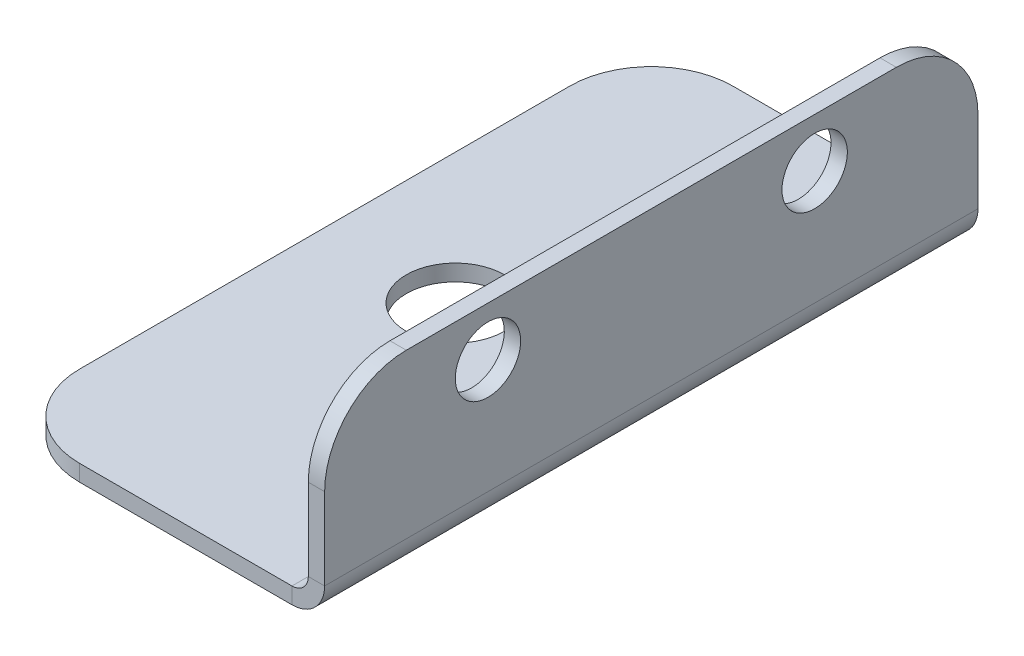
ISO-10303-21;
HEADER;
FILE_DESCRIPTION(('STEP AP214'),'2;1');
FILE_NAME('part.step','',(''),(''),'','','');
FILE_SCHEMA(('AUTOMOTIVE_DESIGN { 1 0 10303 214 1 1 1 1 }'));
ENDSEC;
DATA;
#1=APPLICATION_CONTEXT('core data for automotive mechanical design processes');
#2=APPLICATION_PROTOCOL_DEFINITION('international standard','automotive_design',2000,#1);
#3=PRODUCT_CONTEXT('',#1,'mechanical');
#4=PRODUCT('Part','Part','',(#3));
#5=PRODUCT_RELATED_PRODUCT_CATEGORY('part','',(#4));
#6=PRODUCT_DEFINITION_FORMATION('','',#4);
#7=PRODUCT_DEFINITION_CONTEXT('part definition',#1,'design');
#8=PRODUCT_DEFINITION('design','',#6,#7);
#9=PRODUCT_DEFINITION_SHAPE('','',#8);
#10=(LENGTH_UNIT() NAMED_UNIT(*) SI_UNIT(.MILLI.,.METRE.));
#11=(NAMED_UNIT(*) PLANE_ANGLE_UNIT() SI_UNIT($,.RADIAN.));
#12=(NAMED_UNIT(*) SI_UNIT($,.STERADIAN.) SOLID_ANGLE_UNIT());
#13=UNCERTAINTY_MEASURE_WITH_UNIT(LENGTH_MEASURE(1.E-05),#10,'distance_accuracy_value','');
#14=(GEOMETRIC_REPRESENTATION_CONTEXT(3) GLOBAL_UNCERTAINTY_ASSIGNED_CONTEXT((#13)) GLOBAL_UNIT_ASSIGNED_CONTEXT((#10,
#11,#12)) REPRESENTATION_CONTEXT('',''));
#15=CARTESIAN_POINT('',(0.,0.,0.));
#16=DIRECTION('',(0.,0.,1.));
#17=DIRECTION('',(1.,0.,0.));
#18=AXIS2_PLACEMENT_3D('',#15,#16,#17);
#19=CARTESIAN_POINT('',(-2.,0.,40.));
#20=DIRECTION('',(0.,0.,1.));
#21=DIRECTION('',(1.,0.,0.));
#22=AXIS2_PLACEMENT_3D('',#19,#20,#21);
#23=PLANE('',#22);
#24=DIRECTION('',(0.,1.,0.));
#25=VECTOR('',#24,1.);
#26=CARTESIAN_POINT('',(-2.,0.,40.));
#27=LINE('',#26,#25);
#28=CARTESIAN_POINT('',(-2.,0.,40.));
#29=VERTEX_POINT('',#28);
#30=CARTESIAN_POINT('',(-2.,1.,40.));
#31=VERTEX_POINT('',#30);
#32=EDGE_CURVE('E138',#29,#31,#27,.T.);
#33=ORIENTED_EDGE('',*,*,#32,.F.);
#34=CARTESIAN_POINT('',(-2.,2.,40.));
#35=DIRECTION('',(0.,0.,1.));
#36=DIRECTION('',(1.,0.,0.));
#37=AXIS2_PLACEMENT_3D('',#34,#35,#36);
#38=CIRCLE('',#37,2.);
#39=CARTESIAN_POINT('',(0.,2.,40.));
#40=VERTEX_POINT('',#39);
#41=EDGE_CURVE('E142',#40,#29,#38,.F.);
#42=ORIENTED_EDGE('',*,*,#41,.F.);
#43=DIRECTION('',(1.,0.,0.));
#44=VECTOR('',#43,1.);
#45=CARTESIAN_POINT('',(-1.,2.,40.));
#46=LINE('',#45,#44);
#47=CARTESIAN_POINT('',(-1.,2.,40.));
#48=VERTEX_POINT('',#47);
#49=EDGE_CURVE('E151',#48,#40,#46,.T.);
#50=ORIENTED_EDGE('',*,*,#49,.F.);
#51=CARTESIAN_POINT('',(-2.,2.,40.));
#52=DIRECTION('',(0.,0.,1.));
#53=DIRECTION('',(1.,0.,0.));
#54=AXIS2_PLACEMENT_3D('',#51,#52,#53);
#55=CIRCLE('',#54,1.);
#56=EDGE_CURVE('E144',#48,#31,#55,.F.);
#57=ORIENTED_EDGE('',*,*,#56,.T.);
#58=EDGE_LOOP('',(#33,#42,#50,#57));
#59=FACE_BOUND('',#58,.T.);
#60=ADVANCED_FACE('F47',(#59),#23,.T.);
#61=CARTESIAN_POINT('',(-1.,2.,40.));
#62=DIRECTION('',(0.,0.,1.));
#63=DIRECTION('',(1.,0.,0.));
#64=AXIS2_PLACEMENT_3D('',#61,#62,#63);
#65=PLANE('',#64);
#66=DIRECTION('',(-1.,0.,0.));
#67=VECTOR('',#66,1.);
#68=CARTESIAN_POINT('',(0.,1.,40.));
#69=LINE('',#68,#67);
#70=CARTESIAN_POINT('',(-15.,0.999999999999998,40.));
#71=VERTEX_POINT('',#70);
#72=EDGE_CURVE('E174',#31,#71,#69,.T.);
#73=ORIENTED_EDGE('',*,*,#72,.T.);
#74=DIRECTION('',(0.,1.,0.));
#75=VECTOR('',#74,1.);
#76=CARTESIAN_POINT('',(-15.,2.,40.));
#77=LINE('',#76,#75);
#78=CARTESIAN_POINT('',(-15.,0.,40.));
#79=VERTEX_POINT('',#78);
#80=EDGE_CURVE('E172',#71,#79,#77,.F.);
#81=ORIENTED_EDGE('',*,*,#80,.T.);
#82=DIRECTION('',(-1.,0.,0.));
#83=VECTOR('',#82,1.);
#84=CARTESIAN_POINT('',(0.,0.,40.));
#85=LINE('',#84,#83);
#86=EDGE_CURVE('E159',#29,#79,#85,.T.);
#87=ORIENTED_EDGE('',*,*,#86,.F.);
#88=ORIENTED_EDGE('',*,*,#32,.T.);
#89=EDGE_LOOP('',(#73,#81,#87,#88));
#90=FACE_BOUND('',#89,.T.);
#91=ADVANCED_FACE('F170',(#90),#65,.T.);
#92=CARTESIAN_POINT('',(0.,2.,0.));
#93=DIRECTION('',(0.,0.,-1.));
#94=DIRECTION('',(-1.,0.,0.));
#95=AXIS2_PLACEMENT_3D('',#92,#93,#94);
#96=PLANE('',#95);
#97=DIRECTION('',(-1.,0.,0.));
#98=VECTOR('',#97,1.);
#99=CARTESIAN_POINT('',(0.,2.,0.));
#100=LINE('',#99,#98);
#101=CARTESIAN_POINT('',(0.,2.,0.));
#102=VERTEX_POINT('',#101);
#103=CARTESIAN_POINT('',(-1.,2.,0.));
#104=VERTEX_POINT('',#103);
#105=EDGE_CURVE('E237',#102,#104,#100,.T.);
#106=ORIENTED_EDGE('',*,*,#105,.F.);
#107=CARTESIAN_POINT('',(-2.,2.,0.));
#108=DIRECTION('',(0.,0.,1.));
#109=DIRECTION('',(1.,0.,0.));
#110=AXIS2_PLACEMENT_3D('',#107,#108,#109);
#111=CIRCLE('',#110,2.);
#112=CARTESIAN_POINT('',(-2.,0.,0.));
#113=VERTEX_POINT('',#112);
#114=EDGE_CURVE('E199',#102,#113,#111,.F.);
#115=ORIENTED_EDGE('',*,*,#114,.T.);
#116=DIRECTION('',(0.,-1.,0.));
#117=VECTOR('',#116,1.);
#118=CARTESIAN_POINT('',(-2.,1.,0.));
#119=LINE('',#118,#117);
#120=CARTESIAN_POINT('',(-2.,1.,0.));
#121=VERTEX_POINT('',#120);
#122=EDGE_CURVE('E234',#121,#113,#119,.T.);
#123=ORIENTED_EDGE('',*,*,#122,.F.);
#124=CARTESIAN_POINT('',(-2.,2.,0.));
#125=DIRECTION('',(0.,0.,1.));
#126=DIRECTION('',(1.,0.,0.));
#127=AXIS2_PLACEMENT_3D('',#124,#125,#126);
#128=CIRCLE('',#127,1.);
#129=EDGE_CURVE('E208',#104,#121,#128,.F.);
#130=ORIENTED_EDGE('',*,*,#129,.F.);
#131=EDGE_LOOP('',(#106,#115,#123,#130));
#132=FACE_BOUND('',#131,.T.);
#133=ADVANCED_FACE('F373',(#132),#96,.T.);
#134=CARTESIAN_POINT('',(-2.,1.,0.));
#135=DIRECTION('',(0.,0.,-1.));
#136=DIRECTION('',(-1.,0.,0.));
#137=AXIS2_PLACEMENT_3D('',#134,#135,#136);
#138=PLANE('',#137);
#139=DIRECTION('',(0.,-1.,0.));
#140=VECTOR('',#139,1.);
#141=CARTESIAN_POINT('',(-1.,12.,0.));
#142=LINE('',#141,#140);
#143=CARTESIAN_POINT('',(-1.,7.,0.));
#144=VERTEX_POINT('',#143);
#145=EDGE_CURVE('E205',#144,#104,#142,.T.);
#146=ORIENTED_EDGE('',*,*,#145,.F.);
#147=DIRECTION('',(1.,0.,0.));
#148=VECTOR('',#147,1.);
#149=CARTESIAN_POINT('',(-2.,7.,0.));
#150=LINE('',#149,#148);
#151=CARTESIAN_POINT('',(0.,7.,0.));
#152=VERTEX_POINT('',#151);
#153=EDGE_CURVE('E278',#144,#152,#150,.T.);
#154=ORIENTED_EDGE('',*,*,#153,.T.);
#155=DIRECTION('',(0.,-1.,0.));
#156=VECTOR('',#155,1.);
#157=CARTESIAN_POINT('',(0.,12.,0.));
#158=LINE('',#157,#156);
#159=EDGE_CURVE('E202',#152,#102,#158,.T.);
#160=ORIENTED_EDGE('',*,*,#159,.T.);
#161=ORIENTED_EDGE('',*,*,#105,.T.);
#162=EDGE_LOOP('',(#146,#154,#160,#161));
#163=FACE_BOUND('',#162,.T.);
#164=ADVANCED_FACE('F305',(#163),#138,.T.);
#165=CARTESIAN_POINT('',(0.,1.,40.));
#166=DIRECTION('',(0.,-1.,0.));
#167=DIRECTION('',(1.,0.,0.));
#168=AXIS2_PLACEMENT_3D('',#165,#166,#167);
#169=PLANE('',#168);
#170=CARTESIAN_POINT('',(-12.,0.999999999999999,20.));
#171=DIRECTION('',(0.,-1.,0.));
#172=DIRECTION('',(1.,0.,0.));
#173=AXIS2_PLACEMENT_3D('',#170,#171,#172);
#174=CIRCLE('',#173,3.);
#175=CARTESIAN_POINT('',(-9.,0.999999999999999,20.));
#176=VERTEX_POINT('',#175);
#177=EDGE_CURVE('E196',#176,#176,#174,.T.);
#178=ORIENTED_EDGE('',*,*,#177,.T.);
#179=EDGE_LOOP('',(#178));
#180=FACE_BOUND('',#179,.T.);
#181=DIRECTION('',(0.,0.,-1.));
#182=VECTOR('',#181,1.);
#183=CARTESIAN_POINT('',(-20.,0.999999999999998,40.));
#184=LINE('',#183,#182);
#185=CARTESIAN_POINT('',(-20.,0.999999999999998,35.));
#186=VERTEX_POINT('',#185);
#187=CARTESIAN_POINT('',(-20.,0.999999999999998,5.));
#188=VERTEX_POINT('',#187);
#189=EDGE_CURVE('E230',#186,#188,#184,.T.);
#190=ORIENTED_EDGE('',*,*,#189,.F.);
#191=CARTESIAN_POINT('',(-15.,0.999999999999998,35.));
#192=DIRECTION('',(0.,-1.,0.));
#193=DIRECTION('',(1.,0.,0.));
#194=AXIS2_PLACEMENT_3D('',#191,#192,#193);
#195=CIRCLE('',#194,5.);
#196=EDGE_CURVE('E263',#186,#71,#195,.F.);
#197=ORIENTED_EDGE('',*,*,#196,.T.);
#198=ORIENTED_EDGE('',*,*,#72,.F.);
#199=DIRECTION('',(0.,0.,-1.));
#200=VECTOR('',#199,1.);
#201=CARTESIAN_POINT('',(-2.,1.,40.));
#202=LINE('',#201,#200);
#203=EDGE_CURVE('E191',#31,#121,#202,.T.);
#204=ORIENTED_EDGE('',*,*,#203,.T.);
#205=DIRECTION('',(-1.,0.,0.));
#206=VECTOR('',#205,1.);
#207=CARTESIAN_POINT('',(0.,1.,0.));
#208=LINE('',#207,#206);
#209=CARTESIAN_POINT('',(-15.,0.999999999999998,0.));
#210=VERTEX_POINT('',#209);
#211=EDGE_CURVE('E192',#121,#210,#208,.T.);
#212=ORIENTED_EDGE('',*,*,#211,.T.);
#213=CARTESIAN_POINT('',(-15.,0.999999999999998,5.));
#214=DIRECTION('',(0.,-1.,0.));
#215=DIRECTION('',(1.,0.,0.));
#216=AXIS2_PLACEMENT_3D('',#213,#214,#215);
#217=CIRCLE('',#216,5.);
#218=EDGE_CURVE('E260',#210,#188,#217,.F.);
#219=ORIENTED_EDGE('',*,*,#218,.T.);
#220=EDGE_LOOP('',(#190,#197,#198,#204,#212,#219));
#221=FACE_BOUND('',#220,.T.);
#222=ADVANCED_FACE('F324',(#180,#221),#169,.F.);
#223=CARTESIAN_POINT('',(-20.,0.,40.));
#224=DIRECTION('',(-1.,0.,0.));
#225=DIRECTION('',(0.,0.,1.));
#226=AXIS2_PLACEMENT_3D('',#223,#224,#225);
#227=PLANE('',#226);
#228=DIRECTION('',(0.,0.,-1.));
#229=VECTOR('',#228,1.);
#230=CARTESIAN_POINT('',(-20.,0.,40.));
#231=LINE('',#230,#229);
#232=CARTESIAN_POINT('',(-20.,0.,35.));
#233=VERTEX_POINT('',#232);
#234=CARTESIAN_POINT('',(-20.,0.,5.));
#235=VERTEX_POINT('',#234);
#236=EDGE_CURVE('E167',#233,#235,#231,.T.);
#237=ORIENTED_EDGE('',*,*,#236,.F.);
#238=DIRECTION('',(0.,1.,0.));
#239=VECTOR('',#238,1.);
#240=CARTESIAN_POINT('',(-20.,0.,35.));
#241=LINE('',#240,#239);
#242=EDGE_CURVE('E256',#233,#186,#241,.T.);
#243=ORIENTED_EDGE('',*,*,#242,.T.);
#244=ORIENTED_EDGE('',*,*,#189,.T.);
#245=DIRECTION('',(0.,1.,0.));
#246=VECTOR('',#245,1.);
#247=CARTESIAN_POINT('',(-20.,0.,5.));
#248=LINE('',#247,#246);
#249=EDGE_CURVE('E150',#188,#235,#248,.F.);
#250=ORIENTED_EDGE('',*,*,#249,.T.);
#251=EDGE_LOOP('',(#237,#243,#244,#250));
#252=FACE_BOUND('',#251,.T.);
#253=ADVANCED_FACE('F496',(#252),#227,.T.);
#254=CARTESIAN_POINT('',(0.,0.,40.));
#255=DIRECTION('',(0.,-1.,0.));
#256=DIRECTION('',(1.,0.,0.));
#257=AXIS2_PLACEMENT_3D('',#254,#255,#256);
#258=PLANE('',#257);
#259=CARTESIAN_POINT('',(-12.,0.,20.));
#260=DIRECTION('',(0.,1.,0.));
#261=DIRECTION('',(-1.,0.,0.));
#262=AXIS2_PLACEMENT_3D('',#259,#260,#261);
#263=CIRCLE('',#262,3.);
#264=CARTESIAN_POINT('',(-15.,0.,20.));
#265=VERTEX_POINT('',#264);
#266=EDGE_CURVE('E253',#265,#265,#263,.T.);
#267=ORIENTED_EDGE('',*,*,#266,.T.);
#268=EDGE_LOOP('',(#267));
#269=FACE_BOUND('',#268,.T.);
#270=ORIENTED_EDGE('',*,*,#86,.T.);
#271=CARTESIAN_POINT('',(-15.,0.,35.));
#272=DIRECTION('',(0.,-1.,0.));
#273=DIRECTION('',(1.,0.,0.));
#274=AXIS2_PLACEMENT_3D('',#271,#272,#273);
#275=CIRCLE('',#274,5.);
#276=EDGE_CURVE('E271',#79,#233,#275,.T.);
#277=ORIENTED_EDGE('',*,*,#276,.T.);
#278=ORIENTED_EDGE('',*,*,#236,.T.);
#279=CARTESIAN_POINT('',(-15.,0.,5.));
#280=DIRECTION('',(0.,-1.,0.));
#281=DIRECTION('',(1.,0.,0.));
#282=AXIS2_PLACEMENT_3D('',#279,#280,#281);
#283=CIRCLE('',#282,5.);
#284=CARTESIAN_POINT('',(-15.,0.,0.));
#285=VERTEX_POINT('',#284);
#286=EDGE_CURVE('E268',#235,#285,#283,.T.);
#287=ORIENTED_EDGE('',*,*,#286,.T.);
#288=DIRECTION('',(-1.,0.,0.));
#289=VECTOR('',#288,1.);
#290=CARTESIAN_POINT('',(0.,0.,0.));
#291=LINE('',#290,#289);
#292=EDGE_CURVE('E162',#113,#285,#291,.T.);
#293=ORIENTED_EDGE('',*,*,#292,.F.);
#294=DIRECTION('',(0.,0.,-1.));
#295=VECTOR('',#294,1.);
#296=CARTESIAN_POINT('',(-2.,0.,40.));
#297=LINE('',#296,#295);
#298=EDGE_CURVE('E157',#29,#113,#297,.T.);
#299=ORIENTED_EDGE('',*,*,#298,.F.);
#300=EDGE_LOOP('',(#270,#277,#278,#287,#293,#299));
#301=FACE_BOUND('',#300,.T.);
#302=ADVANCED_FACE('F158',(#269,#301),#258,.T.);
#303=CARTESIAN_POINT('',(-2.,2.,40.));
#304=DIRECTION('',(0.,0.,-1.));
#305=DIRECTION('',(-1.,0.,0.));
#306=AXIS2_PLACEMENT_3D('',#303,#304,#305);
#307=CYLINDRICAL_SURFACE('',#306,2.);
#308=ORIENTED_EDGE('',*,*,#114,.F.);
#309=DIRECTION('',(0.,0.,-1.));
#310=VECTOR('',#309,1.);
#311=CARTESIAN_POINT('',(0.,2.,40.));
#312=LINE('',#311,#310);
#313=EDGE_CURVE('E168',#40,#102,#312,.T.);
#314=ORIENTED_EDGE('',*,*,#313,.F.);
#315=ORIENTED_EDGE('',*,*,#41,.T.);
#316=ORIENTED_EDGE('',*,*,#298,.T.);
#317=EDGE_LOOP('',(#308,#314,#315,#316));
#318=FACE_BOUND('',#317,.T.);
#319=ADVANCED_FACE('F177',(#318),#307,.T.);
#320=CARTESIAN_POINT('',(0.,12.,40.));
#321=DIRECTION('',(1.,0.,0.));
#322=DIRECTION('',(0.,1.,0.));
#323=AXIS2_PLACEMENT_3D('',#320,#321,#322);
#324=PLANE('',#323);
#325=CARTESIAN_POINT('',(0.,9.,10.));
#326=DIRECTION('',(-1.,0.,0.));
#327=DIRECTION('',(0.,0.,1.));
#328=AXIS2_PLACEMENT_3D('',#325,#326,#327);
#329=CIRCLE('',#328,2.);
#330=CARTESIAN_POINT('',(0.,9.,12.));
#331=VERTEX_POINT('',#330);
#332=EDGE_CURVE('E249',#331,#331,#329,.T.);
#333=ORIENTED_EDGE('',*,*,#332,.T.);
#334=EDGE_LOOP('',(#333));
#335=FACE_BOUND('',#334,.T.);
#336=CARTESIAN_POINT('',(0.,9.,30.));
#337=DIRECTION('',(-1.,0.,0.));
#338=DIRECTION('',(0.,0.,1.));
#339=AXIS2_PLACEMENT_3D('',#336,#337,#338);
#340=CIRCLE('',#339,2.00000000000001);
#341=CARTESIAN_POINT('',(0.,9.,32.));
#342=VERTEX_POINT('',#341);
#343=EDGE_CURVE('E333',#342,#342,#340,.T.);
#344=ORIENTED_EDGE('',*,*,#343,.T.);
#345=EDGE_LOOP('',(#344));
#346=FACE_BOUND('',#345,.T.);
#347=ORIENTED_EDGE('',*,*,#159,.F.);
#348=CARTESIAN_POINT('',(0.,7.,5.));
#349=DIRECTION('',(1.,0.,0.));
#350=DIRECTION('',(0.,1.,0.));
#351=AXIS2_PLACEMENT_3D('',#348,#349,#350);
#352=CIRCLE('',#351,5.);
#353=CARTESIAN_POINT('',(0.,12.,5.));
#354=VERTEX_POINT('',#353);
#355=EDGE_CURVE('E285',#152,#354,#352,.T.);
#356=ORIENTED_EDGE('',*,*,#355,.T.);
#357=DIRECTION('',(0.,0.,-1.));
#358=VECTOR('',#357,1.);
#359=CARTESIAN_POINT('',(0.,12.,40.));
#360=LINE('',#359,#358);
#361=CARTESIAN_POINT('',(0.,12.,35.));
#362=VERTEX_POINT('',#361);
#363=EDGE_CURVE('E222',#362,#354,#360,.T.);
#364=ORIENTED_EDGE('',*,*,#363,.F.);
#365=CARTESIAN_POINT('',(0.,7.,35.));
#366=DIRECTION('',(1.,0.,0.));
#367=DIRECTION('',(0.,1.,0.));
#368=AXIS2_PLACEMENT_3D('',#365,#366,#367);
#369=CIRCLE('',#368,5.);
#370=CARTESIAN_POINT('',(0.,7.,40.));
#371=VERTEX_POINT('',#370);
#372=EDGE_CURVE('E282',#362,#371,#369,.T.);
#373=ORIENTED_EDGE('',*,*,#372,.T.);
#374=DIRECTION('',(0.,-1.,0.));
#375=VECTOR('',#374,1.);
#376=CARTESIAN_POINT('',(0.,12.,40.));
#377=LINE('',#376,#375);
#378=EDGE_CURVE('E180',#371,#40,#377,.T.);
#379=ORIENTED_EDGE('',*,*,#378,.T.);
#380=ORIENTED_EDGE('',*,*,#313,.T.);
#381=EDGE_LOOP('',(#347,#356,#364,#373,#379,#380));
#382=FACE_BOUND('',#381,.T.);
#383=ADVANCED_FACE('F311',(#335,#346,#382),#324,.T.);
#384=CARTESIAN_POINT('',(-1.,12.,40.));
#385=DIRECTION('',(0.,1.,0.));
#386=DIRECTION('',(0.,0.,1.));
#387=AXIS2_PLACEMENT_3D('',#384,#385,#386);
#388=PLANE('',#387);
#389=ORIENTED_EDGE('',*,*,#363,.T.);
#390=DIRECTION('',(1.,0.,0.));
#391=VECTOR('',#390,1.);
#392=CARTESIAN_POINT('',(-1.,12.,5.));
#393=LINE('',#392,#391);
#394=CARTESIAN_POINT('',(-1.,12.,5.));
#395=VERTEX_POINT('',#394);
#396=EDGE_CURVE('E69',#354,#395,#393,.F.);
#397=ORIENTED_EDGE('',*,*,#396,.T.);
#398=DIRECTION('',(0.,0.,-1.));
#399=VECTOR('',#398,1.);
#400=CARTESIAN_POINT('',(-1.,12.,40.));
#401=LINE('',#400,#399);
#402=CARTESIAN_POINT('',(-1.,12.,35.));
#403=VERTEX_POINT('',#402);
#404=EDGE_CURVE('E219',#403,#395,#401,.T.);
#405=ORIENTED_EDGE('',*,*,#404,.F.);
#406=DIRECTION('',(1.,0.,0.));
#407=VECTOR('',#406,1.);
#408=CARTESIAN_POINT('',(-1.,12.,35.));
#409=LINE('',#408,#407);
#410=EDGE_CURVE('E288',#403,#362,#409,.T.);
#411=ORIENTED_EDGE('',*,*,#410,.T.);
#412=EDGE_LOOP('',(#389,#397,#405,#411));
#413=FACE_BOUND('',#412,.T.);
#414=ADVANCED_FACE('F312',(#413),#388,.T.);
#415=CARTESIAN_POINT('',(-1.,12.,40.));
#416=DIRECTION('',(1.,0.,0.));
#417=DIRECTION('',(0.,1.,0.));
#418=AXIS2_PLACEMENT_3D('',#415,#416,#417);
#419=PLANE('',#418);
#420=CARTESIAN_POINT('',(-1.,9.,10.));
#421=DIRECTION('',(1.,0.,0.));
#422=DIRECTION('',(0.,1.,0.));
#423=AXIS2_PLACEMENT_3D('',#420,#421,#422);
#424=CIRCLE('',#423,2.);
#425=CARTESIAN_POINT('',(-1.,11.,10.));
#426=VERTEX_POINT('',#425);
#427=EDGE_CURVE('E248',#426,#426,#424,.T.);
#428=ORIENTED_EDGE('',*,*,#427,.T.);
#429=EDGE_LOOP('',(#428));
#430=FACE_BOUND('',#429,.T.);
#431=CARTESIAN_POINT('',(-1.,9.,30.));
#432=DIRECTION('',(1.,0.,0.));
#433=DIRECTION('',(0.,1.,0.));
#434=AXIS2_PLACEMENT_3D('',#431,#432,#433);
#435=CIRCLE('',#434,2.00000000000001);
#436=CARTESIAN_POINT('',(-1.,11.,30.));
#437=VERTEX_POINT('',#436);
#438=EDGE_CURVE('E244',#437,#437,#435,.T.);
#439=ORIENTED_EDGE('',*,*,#438,.T.);
#440=EDGE_LOOP('',(#439));
#441=FACE_BOUND('',#440,.T.);
#442=ORIENTED_EDGE('',*,*,#404,.T.);
#443=CARTESIAN_POINT('',(-1.,7.,5.));
#444=DIRECTION('',(1.,0.,0.));
#445=DIRECTION('',(0.,1.,0.));
#446=AXIS2_PLACEMENT_3D('',#443,#444,#445);
#447=CIRCLE('',#446,5.);
#448=EDGE_CURVE('E56',#395,#144,#447,.F.);
#449=ORIENTED_EDGE('',*,*,#448,.T.);
#450=ORIENTED_EDGE('',*,*,#145,.T.);
#451=DIRECTION('',(0.,0.,-1.));
#452=VECTOR('',#451,1.);
#453=CARTESIAN_POINT('',(-1.,2.,40.));
#454=LINE('',#453,#452);
#455=EDGE_CURVE('E215',#48,#104,#454,.T.);
#456=ORIENTED_EDGE('',*,*,#455,.F.);
#457=DIRECTION('',(0.,-1.,0.));
#458=VECTOR('',#457,1.);
#459=CARTESIAN_POINT('',(-1.,12.,40.));
#460=LINE('',#459,#458);
#461=CARTESIAN_POINT('',(-1.,7.,40.));
#462=VERTEX_POINT('',#461);
#463=EDGE_CURVE('E183',#462,#48,#460,.T.);
#464=ORIENTED_EDGE('',*,*,#463,.F.);
#465=CARTESIAN_POINT('',(-1.,7.,35.));
#466=DIRECTION('',(1.,0.,0.));
#467=DIRECTION('',(0.,1.,0.));
#468=AXIS2_PLACEMENT_3D('',#465,#466,#467);
#469=CIRCLE('',#468,5.);
#470=EDGE_CURVE('E294',#462,#403,#469,.F.);
#471=ORIENTED_EDGE('',*,*,#470,.T.);
#472=EDGE_LOOP('',(#442,#449,#450,#456,#464,#471));
#473=FACE_BOUND('',#472,.T.);
#474=ADVANCED_FACE('F300',(#430,#441,#473),#419,.F.);
#475=CARTESIAN_POINT('',(-2.,2.,40.));
#476=DIRECTION('',(0.,0.,-1.));
#477=DIRECTION('',(-1.,0.,0.));
#478=AXIS2_PLACEMENT_3D('',#475,#476,#477);
#479=CYLINDRICAL_SURFACE('',#478,1.);
#480=ORIENTED_EDGE('',*,*,#129,.T.);
#481=ORIENTED_EDGE('',*,*,#203,.F.);
#482=ORIENTED_EDGE('',*,*,#56,.F.);
#483=ORIENTED_EDGE('',*,*,#455,.T.);
#484=EDGE_LOOP('',(#480,#481,#482,#483));
#485=FACE_BOUND('',#484,.T.);
#486=ADVANCED_FACE('F319',(#485),#479,.F.);
#487=CARTESIAN_POINT('',(-2.,2.,40.));
#488=DIRECTION('',(0.,0.,1.));
#489=DIRECTION('',(1.,0.,0.));
#490=AXIS2_PLACEMENT_3D('',#487,#488,#489);
#491=PLANE('',#490);
#492=ORIENTED_EDGE('',*,*,#378,.F.);
#493=DIRECTION('',(1.,0.,0.));
#494=VECTOR('',#493,1.);
#495=CARTESIAN_POINT('',(-2.,7.,40.));
#496=LINE('',#495,#494);
#497=EDGE_CURVE('E11',#371,#462,#496,.F.);
#498=ORIENTED_EDGE('',*,*,#497,.T.);
#499=ORIENTED_EDGE('',*,*,#463,.T.);
#500=ORIENTED_EDGE('',*,*,#49,.T.);
#501=EDGE_LOOP('',(#492,#498,#499,#500));
#502=FACE_BOUND('',#501,.T.);
#503=ADVANCED_FACE('F316',(#502),#491,.T.);
#504=CARTESIAN_POINT('',(-2.,2.,0.));
#505=DIRECTION('',(0.,0.,1.));
#506=DIRECTION('',(1.,0.,0.));
#507=AXIS2_PLACEMENT_3D('',#504,#505,#506);
#508=PLANE('',#507);
#509=ORIENTED_EDGE('',*,*,#292,.T.);
#510=DIRECTION('',(0.,1.,0.));
#511=VECTOR('',#510,1.);
#512=CARTESIAN_POINT('',(-15.,0.999999999999998,0.));
#513=LINE('',#512,#511);
#514=EDGE_CURVE('E274',#285,#210,#513,.T.);
#515=ORIENTED_EDGE('',*,*,#514,.T.);
#516=ORIENTED_EDGE('',*,*,#211,.F.);
#517=ORIENTED_EDGE('',*,*,#122,.T.);
#518=EDGE_LOOP('',(#509,#515,#516,#517));
#519=FACE_BOUND('',#518,.T.);
#520=ADVANCED_FACE('F363',(#519),#508,.F.);
#521=CARTESIAN_POINT('',(-12.,0.,20.));
#522=DIRECTION('',(0.,1.,0.));
#523=DIRECTION('',(-1.,0.,0.));
#524=AXIS2_PLACEMENT_3D('',#521,#522,#523);
#525=CYLINDRICAL_SURFACE('',#524,3.);
#526=ORIENTED_EDGE('',*,*,#266,.F.);
#527=EDGE_LOOP('',(#526));
#528=FACE_BOUND('',#527,.T.);
#529=ORIENTED_EDGE('',*,*,#177,.F.);
#530=EDGE_LOOP('',(#529));
#531=FACE_BOUND('',#530,.T.);
#532=ADVANCED_FACE('F357',(#528,#531),#525,.F.);
#533=CARTESIAN_POINT('',(0.,9.,30.));
#534=DIRECTION('',(-1.,0.,0.));
#535=DIRECTION('',(0.,0.,1.));
#536=AXIS2_PLACEMENT_3D('',#533,#534,#535);
#537=CYLINDRICAL_SURFACE('',#536,2.00000000000001);
#538=ORIENTED_EDGE('',*,*,#343,.F.);
#539=EDGE_LOOP('',(#538));
#540=FACE_BOUND('',#539,.T.);
#541=ORIENTED_EDGE('',*,*,#438,.F.);
#542=EDGE_LOOP('',(#541));
#543=FACE_BOUND('',#542,.T.);
#544=ADVANCED_FACE('F347',(#540,#543),#537,.F.);
#545=CARTESIAN_POINT('',(0.,9.,10.));
#546=DIRECTION('',(-1.,0.,0.));
#547=DIRECTION('',(0.,0.,1.));
#548=AXIS2_PLACEMENT_3D('',#545,#546,#547);
#549=CYLINDRICAL_SURFACE('',#548,2.);
#550=ORIENTED_EDGE('',*,*,#332,.F.);
#551=EDGE_LOOP('',(#550));
#552=FACE_BOUND('',#551,.T.);
#553=ORIENTED_EDGE('',*,*,#427,.F.);
#554=EDGE_LOOP('',(#553));
#555=FACE_BOUND('',#554,.T.);
#556=ADVANCED_FACE('F343',(#552,#555),#549,.F.);
#557=CARTESIAN_POINT('',(-15.,0.,35.));
#558=DIRECTION('',(0.,1.,0.));
#559=DIRECTION('',(0.,0.,1.));
#560=AXIS2_PLACEMENT_3D('',#557,#558,#559);
#561=CYLINDRICAL_SURFACE('',#560,5.);
#562=ORIENTED_EDGE('',*,*,#276,.F.);
#563=ORIENTED_EDGE('',*,*,#80,.F.);
#564=ORIENTED_EDGE('',*,*,#196,.F.);
#565=ORIENTED_EDGE('',*,*,#242,.F.);
#566=EDGE_LOOP('',(#562,#563,#564,#565));
#567=FACE_BOUND('',#566,.T.);
#568=ADVANCED_FACE('F346',(#567),#561,.T.);
#569=CARTESIAN_POINT('',(-15.,2.,5.));
#570=DIRECTION('',(0.,-1.,0.));
#571=DIRECTION('',(0.,0.,-1.));
#572=AXIS2_PLACEMENT_3D('',#569,#570,#571);
#573=CYLINDRICAL_SURFACE('',#572,5.);
#574=ORIENTED_EDGE('',*,*,#286,.F.);
#575=ORIENTED_EDGE('',*,*,#249,.F.);
#576=ORIENTED_EDGE('',*,*,#218,.F.);
#577=ORIENTED_EDGE('',*,*,#514,.F.);
#578=EDGE_LOOP('',(#574,#575,#576,#577));
#579=FACE_BOUND('',#578,.T.);
#580=ADVANCED_FACE('F379',(#579),#573,.T.);
#581=CARTESIAN_POINT('',(-2.,7.,5.));
#582=DIRECTION('',(1.,0.,0.));
#583=DIRECTION('',(0.,0.,-1.));
#584=AXIS2_PLACEMENT_3D('',#581,#582,#583);
#585=CYLINDRICAL_SURFACE('',#584,5.);
#586=ORIENTED_EDGE('',*,*,#448,.F.);
#587=ORIENTED_EDGE('',*,*,#396,.F.);
#588=ORIENTED_EDGE('',*,*,#355,.F.);
#589=ORIENTED_EDGE('',*,*,#153,.F.);
#590=EDGE_LOOP('',(#586,#587,#588,#589));
#591=FACE_BOUND('',#590,.T.);
#592=ADVANCED_FACE('F308',(#591),#585,.T.);
#593=CARTESIAN_POINT('',(-1.,7.,35.));
#594=DIRECTION('',(1.,0.,0.));
#595=DIRECTION('',(0.,0.,-1.));
#596=AXIS2_PLACEMENT_3D('',#593,#594,#595);
#597=CYLINDRICAL_SURFACE('',#596,5.);
#598=ORIENTED_EDGE('',*,*,#470,.F.);
#599=ORIENTED_EDGE('',*,*,#497,.F.);
#600=ORIENTED_EDGE('',*,*,#372,.F.);
#601=ORIENTED_EDGE('',*,*,#410,.F.);
#602=EDGE_LOOP('',(#598,#599,#600,#601));
#603=FACE_BOUND('',#602,.T.);
#604=ADVANCED_FACE('F49',(#603),#597,.T.);
#605=CLOSED_SHELL('',(#60,#91,#133,#164,#222,#253,#302,#319,#383,#414,#474,#486,#503,#520,#532,
#544,#556,#568,#580,#592,#604));
#606=MANIFOLD_SOLID_BREP('B2',#605);
#607=ADVANCED_BREP_SHAPE_REPRESENTATION('',(#18,#606),#14);
#608=SHAPE_DEFINITION_REPRESENTATION(#9,#607);
ENDSEC;
END-ISO-10303-21;
